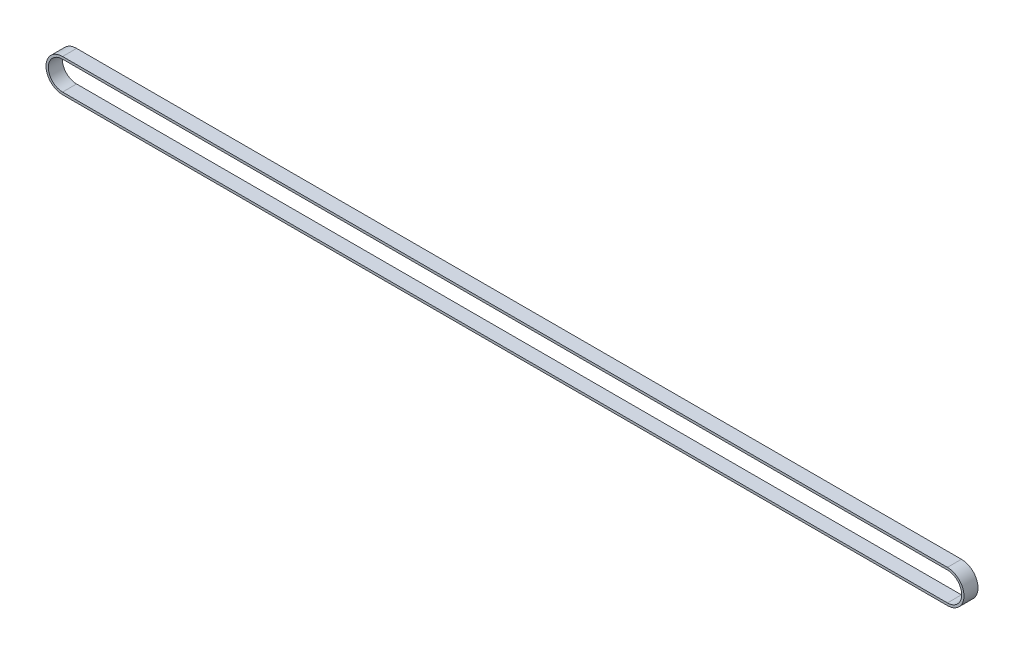
ISO-10303-21;
HEADER;
FILE_DESCRIPTION(('STEP AP214'),'2;1');
FILE_NAME('part.step','',(''),(''),'','','');
FILE_SCHEMA(('AUTOMOTIVE_DESIGN { 1 0 10303 214 1 1 1 1 }'));
ENDSEC;
DATA;
#1=APPLICATION_CONTEXT('core data for automotive mechanical design processes');
#2=APPLICATION_PROTOCOL_DEFINITION('international standard','automotive_design',2000,#1);
#3=PRODUCT_CONTEXT('',#1,'mechanical');
#4=PRODUCT('Part','Part','',(#3));
#5=PRODUCT_RELATED_PRODUCT_CATEGORY('part','',(#4));
#6=PRODUCT_DEFINITION_FORMATION('','',#4);
#7=PRODUCT_DEFINITION_CONTEXT('part definition',#1,'design');
#8=PRODUCT_DEFINITION('design','',#6,#7);
#9=PRODUCT_DEFINITION_SHAPE('','',#8);
#10=(LENGTH_UNIT() NAMED_UNIT(*) SI_UNIT(.MILLI.,.METRE.));
#11=(NAMED_UNIT(*) PLANE_ANGLE_UNIT() SI_UNIT($,.RADIAN.));
#12=(NAMED_UNIT(*) SI_UNIT($,.STERADIAN.) SOLID_ANGLE_UNIT());
#13=UNCERTAINTY_MEASURE_WITH_UNIT(LENGTH_MEASURE(1.E-05),#10,'distance_accuracy_value','');
#14=(GEOMETRIC_REPRESENTATION_CONTEXT(3) GLOBAL_UNCERTAINTY_ASSIGNED_CONTEXT((#13)) GLOBAL_UNIT_ASSIGNED_CONTEXT((#10,
#11,#12)) REPRESENTATION_CONTEXT('',''));
#15=CARTESIAN_POINT('',(0.,0.,0.));
#16=DIRECTION('',(0.,0.,1.));
#17=DIRECTION('',(1.,0.,0.));
#18=AXIS2_PLACEMENT_3D('',#15,#16,#17);
#19=CARTESIAN_POINT('',(0.,6.1,6.));
#20=DIRECTION('',(0.,1.,0.));
#21=DIRECTION('',(0.,0.,1.));
#22=AXIS2_PLACEMENT_3D('',#19,#20,#21);
#23=PLANE('',#22);
#24=DIRECTION('',(1.,0.,0.));
#25=VECTOR('',#24,1.);
#26=CARTESIAN_POINT('',(0.,6.1,0.));
#27=LINE('',#26,#25);
#28=CARTESIAN_POINT('',(0.,6.1,0.));
#29=VERTEX_POINT('',#28);
#30=CARTESIAN_POINT('',(379.1,6.1,0.));
#31=VERTEX_POINT('',#30);
#32=EDGE_CURVE('E115',#29,#31,#27,.T.);
#33=ORIENTED_EDGE('',*,*,#32,.T.);
#34=DIRECTION('',(0.,0.,-1.));
#35=VECTOR('',#34,1.);
#36=CARTESIAN_POINT('',(379.1,6.1,6.));
#37=LINE('',#36,#35);
#38=CARTESIAN_POINT('',(379.1,6.1,6.));
#39=VERTEX_POINT('',#38);
#40=EDGE_CURVE('E113',#39,#31,#37,.T.);
#41=ORIENTED_EDGE('',*,*,#40,.F.);
#42=DIRECTION('',(1.,0.,0.));
#43=VECTOR('',#42,1.);
#44=CARTESIAN_POINT('',(0.,6.1,6.));
#45=LINE('',#44,#43);
#46=CARTESIAN_POINT('',(0.,6.1,6.));
#47=VERTEX_POINT('',#46);
#48=EDGE_CURVE('E104',#47,#39,#45,.T.);
#49=ORIENTED_EDGE('',*,*,#48,.F.);
#50=DIRECTION('',(0.,0.,-1.));
#51=VECTOR('',#50,1.);
#52=CARTESIAN_POINT('',(0.,6.1,6.));
#53=LINE('',#52,#51);
#54=EDGE_CURVE('E150',#47,#29,#53,.T.);
#55=ORIENTED_EDGE('',*,*,#54,.T.);
#56=EDGE_LOOP('',(#33,#41,#49,#55));
#57=FACE_BOUND('',#56,.T.);
#58=ADVANCED_FACE('F34',(#57),#23,.F.);
#59=CARTESIAN_POINT('',(0.,7.1,6.));
#60=DIRECTION('',(0.,1.,0.));
#61=DIRECTION('',(0.,0.,1.));
#62=AXIS2_PLACEMENT_3D('',#59,#60,#61);
#63=PLANE('',#62);
#64=DIRECTION('',(1.,0.,0.));
#65=VECTOR('',#64,1.);
#66=CARTESIAN_POINT('',(0.,7.1,0.));
#67=LINE('',#66,#65);
#68=CARTESIAN_POINT('',(0.,7.1,0.));
#69=VERTEX_POINT('',#68);
#70=CARTESIAN_POINT('',(379.1,7.1,0.));
#71=VERTEX_POINT('',#70);
#72=EDGE_CURVE('E152',#69,#71,#67,.T.);
#73=ORIENTED_EDGE('',*,*,#72,.F.);
#74=DIRECTION('',(0.,0.,-1.));
#75=VECTOR('',#74,1.);
#76=CARTESIAN_POINT('',(0.,7.1,6.));
#77=LINE('',#76,#75);
#78=CARTESIAN_POINT('',(0.,7.1,6.));
#79=VERTEX_POINT('',#78);
#80=EDGE_CURVE('E11',#79,#69,#77,.T.);
#81=ORIENTED_EDGE('',*,*,#80,.F.);
#82=DIRECTION('',(1.,0.,0.));
#83=VECTOR('',#82,1.);
#84=CARTESIAN_POINT('',(0.,7.1,6.));
#85=LINE('',#84,#83);
#86=CARTESIAN_POINT('',(379.1,7.1,6.));
#87=VERTEX_POINT('',#86);
#88=EDGE_CURVE('E110',#79,#87,#85,.T.);
#89=ORIENTED_EDGE('',*,*,#88,.T.);
#90=DIRECTION('',(0.,0.,-1.));
#91=VECTOR('',#90,1.);
#92=CARTESIAN_POINT('',(379.1,7.1,6.));
#93=LINE('',#92,#91);
#94=EDGE_CURVE('E127',#87,#71,#93,.T.);
#95=ORIENTED_EDGE('',*,*,#94,.T.);
#96=EDGE_LOOP('',(#73,#81,#89,#95));
#97=FACE_BOUND('',#96,.T.);
#98=ADVANCED_FACE('F179',(#97),#63,.T.);
#99=CARTESIAN_POINT('',(0.,0.,6.));
#100=DIRECTION('',(0.,0.,-1.));
#101=DIRECTION('',(-1.,0.,0.));
#102=AXIS2_PLACEMENT_3D('',#99,#100,#101);
#103=CYLINDRICAL_SURFACE('',#102,7.1);
#104=CARTESIAN_POINT('',(0.,0.,0.));
#105=DIRECTION('',(0.,0.,1.));
#106=DIRECTION('',(1.,0.,0.));
#107=AXIS2_PLACEMENT_3D('',#104,#105,#106);
#108=CIRCLE('',#107,7.1);
#109=CARTESIAN_POINT('',(0.,-7.1,0.));
#110=VERTEX_POINT('',#109);
#111=EDGE_CURVE('E154',#110,#69,#108,.F.);
#112=ORIENTED_EDGE('',*,*,#111,.F.);
#113=DIRECTION('',(0.,0.,-1.));
#114=VECTOR('',#113,1.);
#115=CARTESIAN_POINT('',(0.,-7.1,6.));
#116=LINE('',#115,#114);
#117=CARTESIAN_POINT('',(0.,-7.1,6.));
#118=VERTEX_POINT('',#117);
#119=EDGE_CURVE('E42',#118,#110,#116,.T.);
#120=ORIENTED_EDGE('',*,*,#119,.F.);
#121=CARTESIAN_POINT('',(0.,0.,6.));
#122=DIRECTION('',(0.,0.,1.));
#123=DIRECTION('',(1.,0.,0.));
#124=AXIS2_PLACEMENT_3D('',#121,#122,#123);
#125=CIRCLE('',#124,7.1);
#126=EDGE_CURVE('E141',#118,#79,#125,.F.);
#127=ORIENTED_EDGE('',*,*,#126,.T.);
#128=ORIENTED_EDGE('',*,*,#80,.T.);
#129=EDGE_LOOP('',(#112,#120,#127,#128));
#130=FACE_BOUND('',#129,.T.);
#131=ADVANCED_FACE('F170',(#130),#103,.T.);
#132=CARTESIAN_POINT('',(189.55,-7.09999999999998,6.));
#133=DIRECTION('',(0.,-1.,0.));
#134=DIRECTION('',(1.,0.,0.));
#135=AXIS2_PLACEMENT_3D('',#132,#133,#134);
#136=PLANE('',#135);
#137=DIRECTION('',(-1.,0.,0.));
#138=VECTOR('',#137,1.);
#139=CARTESIAN_POINT('',(189.55,-7.09999999999998,0.));
#140=LINE('',#139,#138);
#141=CARTESIAN_POINT('',(379.1,-7.1,0.));
#142=VERTEX_POINT('',#141);
#143=EDGE_CURVE('E157',#142,#110,#140,.T.);
#144=ORIENTED_EDGE('',*,*,#143,.F.);
#145=DIRECTION('',(0.,0.,-1.));
#146=VECTOR('',#145,1.);
#147=CARTESIAN_POINT('',(379.1,-7.1,6.));
#148=LINE('',#147,#146);
#149=CARTESIAN_POINT('',(379.1,-7.1,6.));
#150=VERTEX_POINT('',#149);
#151=EDGE_CURVE('E136',#150,#142,#148,.T.);
#152=ORIENTED_EDGE('',*,*,#151,.F.);
#153=DIRECTION('',(-1.,0.,0.));
#154=VECTOR('',#153,1.);
#155=CARTESIAN_POINT('',(189.55,-7.09999999999998,6.));
#156=LINE('',#155,#154);
#157=EDGE_CURVE('E144',#150,#118,#156,.T.);
#158=ORIENTED_EDGE('',*,*,#157,.T.);
#159=ORIENTED_EDGE('',*,*,#119,.T.);
#160=EDGE_LOOP('',(#144,#152,#158,#159));
#161=FACE_BOUND('',#160,.T.);
#162=ADVANCED_FACE('F166',(#161),#136,.T.);
#163=CARTESIAN_POINT('',(189.55,-6.09999999999998,6.));
#164=DIRECTION('',(0.,-1.,0.));
#165=DIRECTION('',(1.,0.,0.));
#166=AXIS2_PLACEMENT_3D('',#163,#164,#165);
#167=PLANE('',#166);
#168=DIRECTION('',(-1.,0.,0.));
#169=VECTOR('',#168,1.);
#170=CARTESIAN_POINT('',(189.55,-6.09999999999998,0.));
#171=LINE('',#170,#169);
#172=CARTESIAN_POINT('',(379.1,-6.1,0.));
#173=VERTEX_POINT('',#172);
#174=CARTESIAN_POINT('',(0.,-6.1,0.));
#175=VERTEX_POINT('',#174);
#176=EDGE_CURVE('E67',#173,#175,#171,.T.);
#177=ORIENTED_EDGE('',*,*,#176,.T.);
#178=DIRECTION('',(0.,0.,-1.));
#179=VECTOR('',#178,1.);
#180=CARTESIAN_POINT('',(0.,-6.1,6.));
#181=LINE('',#180,#179);
#182=CARTESIAN_POINT('',(0.,-6.1,6.));
#183=VERTEX_POINT('',#182);
#184=EDGE_CURVE('E163',#183,#175,#181,.T.);
#185=ORIENTED_EDGE('',*,*,#184,.F.);
#186=DIRECTION('',(-1.,0.,0.));
#187=VECTOR('',#186,1.);
#188=CARTESIAN_POINT('',(189.55,-6.09999999999998,6.));
#189=LINE('',#188,#187);
#190=CARTESIAN_POINT('',(379.1,-6.1,6.));
#191=VERTEX_POINT('',#190);
#192=EDGE_CURVE('E147',#191,#183,#189,.T.);
#193=ORIENTED_EDGE('',*,*,#192,.F.);
#194=DIRECTION('',(0.,0.,-1.));
#195=VECTOR('',#194,1.);
#196=CARTESIAN_POINT('',(379.1,-6.1,6.));
#197=LINE('',#196,#195);
#198=EDGE_CURVE('E119',#191,#173,#197,.T.);
#199=ORIENTED_EDGE('',*,*,#198,.T.);
#200=EDGE_LOOP('',(#177,#185,#193,#199));
#201=FACE_BOUND('',#200,.T.);
#202=ADVANCED_FACE('F189',(#201),#167,.F.);
#203=CARTESIAN_POINT('',(0.,0.,6.));
#204=DIRECTION('',(0.,0.,-1.));
#205=DIRECTION('',(-1.,0.,0.));
#206=AXIS2_PLACEMENT_3D('',#203,#204,#205);
#207=CYLINDRICAL_SURFACE('',#206,6.1);
#208=CARTESIAN_POINT('',(0.,0.,0.));
#209=DIRECTION('',(0.,0.,-1.));
#210=DIRECTION('',(-1.,0.,0.));
#211=AXIS2_PLACEMENT_3D('',#208,#209,#210);
#212=CIRCLE('',#211,6.1);
#213=EDGE_CURVE('E73',#175,#29,#212,.T.);
#214=ORIENTED_EDGE('',*,*,#213,.T.);
#215=ORIENTED_EDGE('',*,*,#54,.F.);
#216=CARTESIAN_POINT('',(0.,0.,6.));
#217=DIRECTION('',(0.,0.,-1.));
#218=DIRECTION('',(-1.,0.,0.));
#219=AXIS2_PLACEMENT_3D('',#216,#217,#218);
#220=CIRCLE('',#219,6.1);
#221=EDGE_CURVE('E50',#183,#47,#220,.T.);
#222=ORIENTED_EDGE('',*,*,#221,.F.);
#223=ORIENTED_EDGE('',*,*,#184,.T.);
#224=EDGE_LOOP('',(#214,#215,#222,#223));
#225=FACE_BOUND('',#224,.T.);
#226=ADVANCED_FACE('F182',(#225),#207,.F.);
#227=CARTESIAN_POINT('',(0.,0.,6.));
#228=DIRECTION('',(0.,0.,1.));
#229=DIRECTION('',(1.,0.,0.));
#230=AXIS2_PLACEMENT_3D('',#227,#228,#229);
#231=PLANE('',#230);
#232=ORIENTED_EDGE('',*,*,#157,.F.);
#233=CARTESIAN_POINT('',(379.1,0.,6.));
#234=DIRECTION('',(0.,0.,-1.));
#235=DIRECTION('',(-1.,0.,0.));
#236=AXIS2_PLACEMENT_3D('',#233,#234,#235);
#237=CIRCLE('',#236,7.1);
#238=EDGE_CURVE('E123',#150,#87,#237,.F.);
#239=ORIENTED_EDGE('',*,*,#238,.T.);
#240=ORIENTED_EDGE('',*,*,#88,.F.);
#241=ORIENTED_EDGE('',*,*,#126,.F.);
#242=EDGE_LOOP('',(#232,#239,#240,#241));
#243=FACE_BOUND('',#242,.T.);
#244=ORIENTED_EDGE('',*,*,#48,.T.);
#245=CARTESIAN_POINT('',(379.1,0.,6.));
#246=DIRECTION('',(0.,0.,1.));
#247=DIRECTION('',(1.,0.,0.));
#248=AXIS2_PLACEMENT_3D('',#245,#246,#247);
#249=CIRCLE('',#248,6.1);
#250=EDGE_CURVE('E108',#191,#39,#249,.T.);
#251=ORIENTED_EDGE('',*,*,#250,.F.);
#252=ORIENTED_EDGE('',*,*,#192,.T.);
#253=ORIENTED_EDGE('',*,*,#221,.T.);
#254=EDGE_LOOP('',(#244,#251,#252,#253));
#255=FACE_BOUND('',#254,.T.);
#256=ADVANCED_FACE('F106',(#243,#255),#231,.T.);
#257=CARTESIAN_POINT('',(0.,0.,0.));
#258=DIRECTION('',(0.,0.,1.));
#259=DIRECTION('',(1.,0.,0.));
#260=AXIS2_PLACEMENT_3D('',#257,#258,#259);
#261=PLANE('',#260);
#262=CARTESIAN_POINT('',(379.1,0.,0.));
#263=DIRECTION('',(0.,0.,-1.));
#264=DIRECTION('',(-1.,0.,0.));
#265=AXIS2_PLACEMENT_3D('',#262,#263,#264);
#266=CIRCLE('',#265,7.1);
#267=EDGE_CURVE('E124',#142,#71,#266,.F.);
#268=ORIENTED_EDGE('',*,*,#267,.F.);
#269=ORIENTED_EDGE('',*,*,#143,.T.);
#270=ORIENTED_EDGE('',*,*,#111,.T.);
#271=ORIENTED_EDGE('',*,*,#72,.T.);
#272=EDGE_LOOP('',(#268,#269,#270,#271));
#273=FACE_BOUND('',#272,.T.);
#274=ORIENTED_EDGE('',*,*,#32,.F.);
#275=ORIENTED_EDGE('',*,*,#213,.F.);
#276=ORIENTED_EDGE('',*,*,#176,.F.);
#277=CARTESIAN_POINT('',(379.1,0.,0.));
#278=DIRECTION('',(0.,0.,1.));
#279=DIRECTION('',(1.,0.,0.));
#280=AXIS2_PLACEMENT_3D('',#277,#278,#279);
#281=CIRCLE('',#280,6.1);
#282=EDGE_CURVE('E130',#173,#31,#281,.T.);
#283=ORIENTED_EDGE('',*,*,#282,.T.);
#284=EDGE_LOOP('',(#274,#275,#276,#283));
#285=FACE_BOUND('',#284,.T.);
#286=ADVANCED_FACE('F173',(#273,#285),#261,.F.);
#287=CARTESIAN_POINT('',(379.1,0.,6.));
#288=DIRECTION('',(0.,0.,-1.));
#289=DIRECTION('',(-1.,0.,0.));
#290=AXIS2_PLACEMENT_3D('',#287,#288,#289);
#291=CYLINDRICAL_SURFACE('',#290,6.1);
#292=ORIENTED_EDGE('',*,*,#282,.F.);
#293=ORIENTED_EDGE('',*,*,#198,.F.);
#294=ORIENTED_EDGE('',*,*,#250,.T.);
#295=ORIENTED_EDGE('',*,*,#40,.T.);
#296=EDGE_LOOP('',(#292,#293,#294,#295));
#297=FACE_BOUND('',#296,.T.);
#298=ADVANCED_FACE('F122',(#297),#291,.F.);
#299=CARTESIAN_POINT('',(379.1,0.,6.));
#300=DIRECTION('',(0.,0.,-1.));
#301=DIRECTION('',(-1.,0.,0.));
#302=AXIS2_PLACEMENT_3D('',#299,#300,#301);
#303=CYLINDRICAL_SURFACE('',#302,7.1);
#304=ORIENTED_EDGE('',*,*,#267,.T.);
#305=ORIENTED_EDGE('',*,*,#94,.F.);
#306=ORIENTED_EDGE('',*,*,#238,.F.);
#307=ORIENTED_EDGE('',*,*,#151,.T.);
#308=EDGE_LOOP('',(#304,#305,#306,#307));
#309=FACE_BOUND('',#308,.T.);
#310=ADVANCED_FACE('F177',(#309),#303,.T.);
#311=CLOSED_SHELL('',(#58,#98,#131,#162,#202,#226,#256,#286,#298,#310));
#312=MANIFOLD_SOLID_BREP('B2',#311);
#313=ADVANCED_BREP_SHAPE_REPRESENTATION('',(#18,#312),#14);
#314=SHAPE_DEFINITION_REPRESENTATION(#9,#313);
ENDSEC;
END-ISO-10303-21;
